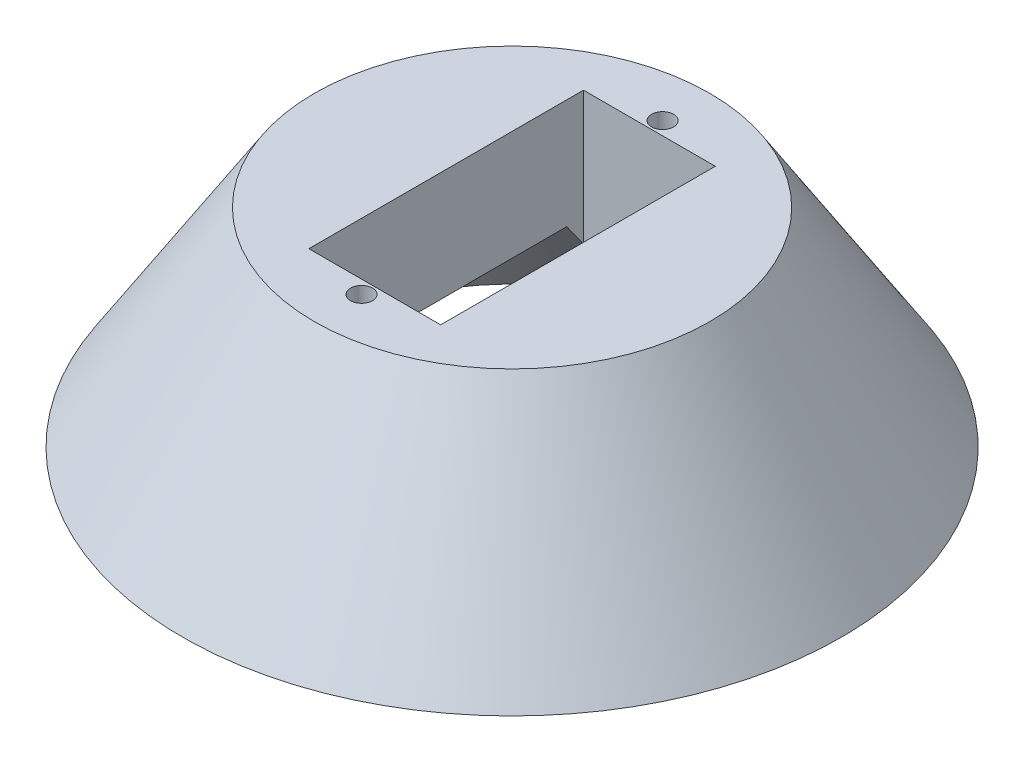
ISO-10303-21;
HEADER;
FILE_DESCRIPTION(('STEP AP214'),'2;1');
FILE_NAME('part.step','',(''),(''),'','','');
FILE_SCHEMA(('AUTOMOTIVE_DESIGN { 1 0 10303 214 1 1 1 1 }'));
ENDSEC;
DATA;
#1=APPLICATION_CONTEXT('core data for automotive mechanical design processes');
#2=APPLICATION_PROTOCOL_DEFINITION('international standard','automotive_design',2000,#1);
#3=PRODUCT_CONTEXT('',#1,'mechanical');
#4=PRODUCT('Part','Part','',(#3));
#5=PRODUCT_RELATED_PRODUCT_CATEGORY('part','',(#4));
#6=PRODUCT_DEFINITION_FORMATION('','',#4);
#7=PRODUCT_DEFINITION_CONTEXT('part definition',#1,'design');
#8=PRODUCT_DEFINITION('design','',#6,#7);
#9=PRODUCT_DEFINITION_SHAPE('','',#8);
#10=(LENGTH_UNIT() NAMED_UNIT(*) SI_UNIT(.MILLI.,.METRE.));
#11=(NAMED_UNIT(*) PLANE_ANGLE_UNIT() SI_UNIT($,.RADIAN.));
#12=(NAMED_UNIT(*) SI_UNIT($,.STERADIAN.) SOLID_ANGLE_UNIT());
#13=UNCERTAINTY_MEASURE_WITH_UNIT(LENGTH_MEASURE(1.E-05),#10,'distance_accuracy_value','');
#14=(GEOMETRIC_REPRESENTATION_CONTEXT(3) GLOBAL_UNCERTAINTY_ASSIGNED_CONTEXT((#13)) GLOBAL_UNIT_ASSIGNED_CONTEXT((#10,
#11,#12)) REPRESENTATION_CONTEXT('',''));
#15=CARTESIAN_POINT('',(0.,0.,0.));
#16=DIRECTION('',(0.,0.,1.));
#17=DIRECTION('',(1.,0.,0.));
#18=AXIS2_PLACEMENT_3D('',#15,#16,#17);
#19=CARTESIAN_POINT('',(0.,8.87265515455283,0.));
#20=DIRECTION('',(0.,-1.,0.));
#21=DIRECTION('',(0.,0.,-1.));
#22=AXIS2_PLACEMENT_3D('',#19,#20,#21);
#23=PLANE('',#22);
#24=DIRECTION('',(0.,0.,1.));
#25=VECTOR('',#24,1.);
#26=CARTESIAN_POINT('',(6.,8.87265515455283,0.));
#27=LINE('',#26,#25);
#28=CARTESIAN_POINT('',(6.,8.87265515455283,-10.9751087622099));
#29=VERTEX_POINT('',#28);
#30=CARTESIAN_POINT('',(6.,8.87265515455283,10.9751087622099));
#31=VERTEX_POINT('',#30);
#32=EDGE_CURVE('E143',#29,#31,#27,.T.);
#33=ORIENTED_EDGE('',*,*,#32,.F.);
#34=CARTESIAN_POINT('',(0.,8.87265515455283,0.));
#35=DIRECTION('',(0.,-1.,0.));
#36=DIRECTION('',(0.,0.,-1.));
#37=AXIS2_PLACEMENT_3D('',#34,#35,#36);
#38=CIRCLE('',#37,12.5081178577089);
#39=EDGE_CURVE('E150',#29,#31,#38,.T.);
#40=ORIENTED_EDGE('',*,*,#39,.T.);
#41=EDGE_LOOP('',(#33,#40));
#42=FACE_BOUND('',#41,.T.);
#43=ADVANCED_FACE('F35',(#42),#23,.T.);
#44=DIRECTION('',(-1.,0.,0.));
#45=VECTOR('',#44,1.);
#46=CARTESIAN_POINT('',(0.,8.87265515455283,12.5));
#47=LINE('',#46,#45);
#48=CARTESIAN_POINT('',(0.450568909643525,8.87265515455283,12.5));
#49=VERTEX_POINT('',#48);
#50=CARTESIAN_POINT('',(-0.450568909643525,8.87265515455284,12.5));
#51=VERTEX_POINT('',#50);
#52=EDGE_CURVE('E141',#49,#51,#47,.T.);
#53=ORIENTED_EDGE('',*,*,#52,.F.);
#54=EDGE_CURVE('E212',#49,#51,#38,.T.);
#55=ORIENTED_EDGE('',*,*,#54,.T.);
#56=EDGE_LOOP('',(#53,#55));
#57=FACE_BOUND('',#56,.T.);
#58=ADVANCED_FACE('F194',(#57),#23,.T.);
#59=DIRECTION('',(0.,0.,-1.));
#60=VECTOR('',#59,1.);
#61=CARTESIAN_POINT('',(-6.,8.87265515455283,0.));
#62=LINE('',#61,#60);
#63=CARTESIAN_POINT('',(-6.,8.87265515455283,10.9751087622099));
#64=VERTEX_POINT('',#63);
#65=CARTESIAN_POINT('',(-6.,8.87265515455283,-10.9751087622099));
#66=VERTEX_POINT('',#65);
#67=EDGE_CURVE('E139',#64,#66,#62,.T.);
#68=ORIENTED_EDGE('',*,*,#67,.F.);
#69=EDGE_CURVE('E149',#64,#66,#38,.T.);
#70=ORIENTED_EDGE('',*,*,#69,.T.);
#71=EDGE_LOOP('',(#68,#70));
#72=FACE_BOUND('',#71,.T.);
#73=ADVANCED_FACE('F186',(#72),#23,.T.);
#74=CARTESIAN_POINT('',(-30.,0.,0.));
#75=DIRECTION('',(0.,1.,0.));
#76=DIRECTION('',(0.,0.,1.));
#77=AXIS2_PLACEMENT_3D('',#74,#75,#76);
#78=PLANE('',#77);
#79=CARTESIAN_POINT('',(0.,0.,0.));
#80=DIRECTION('',(0.,1.,0.));
#81=DIRECTION('',(0.,0.,1.));
#82=AXIS2_PLACEMENT_3D('',#79,#80,#81);
#83=CIRCLE('',#82,18.1497120575028);
#84=CARTESIAN_POINT('',(0.,0.,18.1497120575028));
#85=VERTEX_POINT('',#84);
#86=EDGE_CURVE('E145',#85,#85,#83,.F.);
#87=ORIENTED_EDGE('',*,*,#86,.F.);
#88=EDGE_LOOP('',(#87));
#89=FACE_BOUND('',#88,.T.);
#90=CARTESIAN_POINT('',(0.,0.,0.));
#91=DIRECTION('',(0.,-1.,0.));
#92=DIRECTION('',(0.,0.,-1.));
#93=AXIS2_PLACEMENT_3D('',#90,#91,#92);
#94=CIRCLE('',#93,30.);
#95=CARTESIAN_POINT('',(0.,0.,-30.));
#96=VERTEX_POINT('',#95);
#97=EDGE_CURVE('E153',#96,#96,#94,.T.);
#98=ORIENTED_EDGE('',*,*,#97,.T.);
#99=EDGE_LOOP('',(#98));
#100=FACE_BOUND('',#99,.T.);
#101=ADVANCED_FACE('F37',(#89,#100),#78,.F.);
#102=CARTESIAN_POINT('',(0.,18.8726551545528,0.));
#103=DIRECTION('',(0.,-1.,0.));
#104=DIRECTION('',(0.,0.,-1.));
#105=AXIS2_PLACEMENT_3D('',#102,#103,#104);
#106=PLANE('',#105);
#107=CARTESIAN_POINT('',(0.,18.8726551545528,13.7));
#108=DIRECTION('',(0.,1.,0.));
#109=DIRECTION('',(0.,0.,1.));
#110=AXIS2_PLACEMENT_3D('',#107,#108,#109);
#111=CIRCLE('',#110,1.);
#112=CARTESIAN_POINT('',(0.,18.8726551545528,14.7));
#113=VERTEX_POINT('',#112);
#114=EDGE_CURVE('E231',#113,#113,#111,.T.);
#115=ORIENTED_EDGE('',*,*,#114,.F.);
#116=EDGE_LOOP('',(#115));
#117=FACE_BOUND('',#116,.T.);
#118=CARTESIAN_POINT('',(0.,18.8726551545528,-13.7));
#119=DIRECTION('',(0.,1.,0.));
#120=DIRECTION('',(0.,0.,1.));
#121=AXIS2_PLACEMENT_3D('',#118,#119,#120);
#122=CIRCLE('',#121,1.);
#123=CARTESIAN_POINT('',(0.,18.8726551545528,-12.7));
#124=VERTEX_POINT('',#123);
#125=EDGE_CURVE('E225',#124,#124,#122,.T.);
#126=ORIENTED_EDGE('',*,*,#125,.F.);
#127=EDGE_LOOP('',(#126));
#128=FACE_BOUND('',#127,.T.);
#129=DIRECTION('',(-1.,0.,0.));
#130=VECTOR('',#129,1.);
#131=CARTESIAN_POINT('',(-6.,18.8726551545528,-12.5));
#132=LINE('',#131,#130);
#133=CARTESIAN_POINT('',(6.,18.8726551545528,-12.5));
#134=VERTEX_POINT('',#133);
#135=CARTESIAN_POINT('',(-6.,18.8726551545528,-12.5));
#136=VERTEX_POINT('',#135);
#137=EDGE_CURVE('E122',#134,#136,#132,.T.);
#138=ORIENTED_EDGE('',*,*,#137,.F.);
#139=DIRECTION('',(0.,0.,-1.));
#140=VECTOR('',#139,1.);
#141=CARTESIAN_POINT('',(6.,18.8726551545528,-12.5));
#142=LINE('',#141,#140);
#143=CARTESIAN_POINT('',(6.,18.8726551545528,12.5));
#144=VERTEX_POINT('',#143);
#145=EDGE_CURVE('E58',#144,#134,#142,.T.);
#146=ORIENTED_EDGE('',*,*,#145,.F.);
#147=DIRECTION('',(1.,0.,0.));
#148=VECTOR('',#147,1.);
#149=CARTESIAN_POINT('',(-6.,18.8726551545528,12.5));
#150=LINE('',#149,#148);
#151=CARTESIAN_POINT('',(-6.,18.8726551545528,12.5));
#152=VERTEX_POINT('',#151);
#153=EDGE_CURVE('E129',#152,#144,#150,.T.);
#154=ORIENTED_EDGE('',*,*,#153,.F.);
#155=DIRECTION('',(0.,0.,1.));
#156=VECTOR('',#155,1.);
#157=CARTESIAN_POINT('',(-6.,18.8726551545528,-12.5));
#158=LINE('',#157,#156);
#159=EDGE_CURVE('E113',#136,#152,#158,.T.);
#160=ORIENTED_EDGE('',*,*,#159,.F.);
#161=EDGE_LOOP('',(#138,#146,#154,#160));
#162=FACE_BOUND('',#161,.T.);
#163=CARTESIAN_POINT('',(0.,18.8726551545528,0.));
#164=DIRECTION('',(0.,-1.,0.));
#165=DIRECTION('',(0.,0.,-1.));
#166=AXIS2_PLACEMENT_3D('',#163,#164,#165);
#167=CIRCLE('',#166,18.);
#168=CARTESIAN_POINT('',(0.,18.8726551545528,-18.));
#169=VERTEX_POINT('',#168);
#170=EDGE_CURVE('E156',#169,#169,#167,.T.);
#171=ORIENTED_EDGE('',*,*,#170,.F.);
#172=EDGE_LOOP('',(#171));
#173=FACE_BOUND('',#172,.T.);
#174=ADVANCED_FACE('F126',(#117,#128,#162,#173),#106,.F.);
#175=CARTESIAN_POINT('',(0.,18.8726551545528,0.));
#176=DIRECTION('',(0.,-1.,0.));
#177=DIRECTION('',(0.,0.,-1.));
#178=AXIS2_PLACEMENT_3D('',#175,#176,#177);
#179=CONICAL_SURFACE('',#178,18.,0.566356836274327);
#180=ORIENTED_EDGE('',*,*,#97,.F.);
#181=EDGE_LOOP('',(#180));
#182=FACE_BOUND('',#181,.T.);
#183=ORIENTED_EDGE('',*,*,#170,.T.);
#184=EDGE_LOOP('',(#183));
#185=FACE_BOUND('',#184,.T.);
#186=ADVANCED_FACE('F184',(#182,#185),#179,.T.);
#187=DIRECTION('',(1.,0.,0.));
#188=VECTOR('',#187,1.);
#189=CARTESIAN_POINT('',(0.,8.87265515455283,-12.5));
#190=LINE('',#189,#188);
#191=CARTESIAN_POINT('',(-0.450568909643315,8.87265515455283,-12.5));
#192=VERTEX_POINT('',#191);
#193=CARTESIAN_POINT('',(0.450568909643315,8.87265515455283,-12.5));
#194=VERTEX_POINT('',#193);
#195=EDGE_CURVE('E66',#192,#194,#190,.T.);
#196=ORIENTED_EDGE('',*,*,#195,.F.);
#197=EDGE_CURVE('E146',#192,#194,#38,.T.);
#198=ORIENTED_EDGE('',*,*,#197,.T.);
#199=EDGE_LOOP('',(#196,#198));
#200=FACE_BOUND('',#199,.T.);
#201=ADVANCED_FACE('F182',(#200),#23,.T.);
#202=CARTESIAN_POINT('',(0.,13.5070422419722,0.));
#203=DIRECTION('',(0.,-1.,0.));
#204=DIRECTION('',(0.,0.,-1.));
#205=AXIS2_PLACEMENT_3D('',#202,#203,#204);
#206=CONICAL_SURFACE('',#205,9.56138648400415,0.566356836274327);
#207=CARTESIAN_POINT('',(5.99999999999999,-15.9168781527108,-27.6262624378301));
#208=CARTESIAN_POINT('',(5.99999999999999,-15.3126835724449,-27.233132790407));
#209=CARTESIAN_POINT('',(5.99999999999999,-14.7086596688753,-26.8397408767398));
#210=CARTESIAN_POINT('',(5.99999999999999,-13.5010060074643,-26.0523516327815));
#211=CARTESIAN_POINT('',(5.99999999999999,-12.8973762499001,-25.6583543020652));
#212=CARTESIAN_POINT('',(5.99999999999999,-11.0869758609715,-24.4752142248008));
#213=CARTESIAN_POINT('',(5.99999999999999,-9.88087718198602,-23.6850424400323));
#214=CARTESIAN_POINT('',(5.99999999999999,-7.46555358113903,-22.0974124261076));
#215=CARTESIAN_POINT('',(5.99999999999999,-6.25633969599038,-21.2999373996958));
#216=CARTESIAN_POINT('',(5.99999999999999,-3.84143117645468,-19.700039547942));
#217=CARTESIAN_POINT('',(5.99999999999999,-2.6357360669921,-18.8976174408189));
#218=CARTESIAN_POINT('',(5.99999999999999,-0.757114520321862,-17.6391209416635));
#219=CARTESIAN_POINT('',(5.99999999999999,-0.0825167022128491,-17.1855422019821));
#220=CARTESIAN_POINT('',(5.99999999999999,1.26472542965406,-16.2754941540789));
#221=CARTESIAN_POINT('',(6.,1.93736974814721,-15.8190248528723));
#222=CARTESIAN_POINT('',(6.,3.28046335792535,-14.9021968694587));
#223=CARTESIAN_POINT('',(6.,3.95091148473578,-14.4418364794238));
#224=CARTESIAN_POINT('',(6.,5.28847181410914,-13.5163337713375));
#225=CARTESIAN_POINT('',(6.,5.955584118522,-13.0511916006258));
#226=CARTESIAN_POINT('',(6.,7.28351983328237,-12.1157721863574));
#227=CARTESIAN_POINT('',(6.,7.9443553622316,-11.6455122036121));
#228=CARTESIAN_POINT('',(6.,8.93087755007904,-10.9334703818235));
#229=CARTESIAN_POINT('',(6.,9.25895239805388,-10.6949976618883));
#230=CARTESIAN_POINT('',(6.,9.91315804063228,-10.2154007818022));
#231=CARTESIAN_POINT('',(6.,10.2392888458522,-9.97427663615103));
#232=CARTESIAN_POINT('',(6.,10.8889121542176,-9.48902104127777));
#233=CARTESIAN_POINT('',(6.,11.2124065168235,-9.24489208445668));
#234=CARTESIAN_POINT('',(6.,11.8564132462709,-8.75273388074434));
#235=CARTESIAN_POINT('',(6.,12.1769256568281,-8.50470469117457));
#236=CARTESIAN_POINT('',(6.,12.8140761956443,-8.00385757957522));
#237=CARTESIAN_POINT('',(6.,13.130715183779,-7.7510407533326));
#238=CARTESIAN_POINT('',(6.,13.7590184537992,-7.23931181870506));
#239=CARTESIAN_POINT('',(6.,14.0706830871404,-6.98040014417015));
#240=CARTESIAN_POINT('',(6.,14.525985432256,-6.59222443113));
#241=CARTESIAN_POINT('',(6.,14.6722193621911,-6.46600361465007));
#242=CARTESIAN_POINT('',(6.,14.9629028683053,-6.21150780494194));
#243=CARTESIAN_POINT('',(6.,15.1073523685431,-6.08323272481863));
#244=CARTESIAN_POINT('',(6.,15.3942104903811,-5.82428259589198));
#245=CARTESIAN_POINT('',(6.,15.5366181204284,-5.69360644698792));
#246=CARTESIAN_POINT('',(6.,15.8189179734786,-5.42956405902529));
#247=CARTESIAN_POINT('',(6.,15.9588102397277,-5.2961978663));
#248=CARTESIAN_POINT('',(6.,16.234583156384,-5.0273147544182));
#249=CARTESIAN_POINT('',(6.,16.370485277699,-4.89181990926772));
#250=CARTESIAN_POINT('',(6.,16.6386497474489,-4.61727788563721));
#251=CARTESIAN_POINT('',(6.,16.7709122936149,-4.47823090093262));
#252=CARTESIAN_POINT('',(6.,17.0308707852605,-4.19607936025323));
#253=CARTESIAN_POINT('',(6.,17.1585695549895,-4.05297741553014));
#254=CARTESIAN_POINT('',(6.,17.4083397347131,-3.76196318558314));
#255=CARTESIAN_POINT('',(6.,17.5304122849731,-3.61405188552675));
#256=CARTESIAN_POINT('',(6.,17.7413702588891,-3.34573127258394));
#257=CARTESIAN_POINT('',(6.,17.831652666456,-3.22642286932841));
#258=CARTESIAN_POINT('',(6.,18.0069218328438,-2.98395960997689));
#259=CARTESIAN_POINT('',(6.,18.0919086795007,-2.86080481773077));
#260=CARTESIAN_POINT('',(6.,18.255517002875,-2.6100354621002));
#261=CARTESIAN_POINT('',(6.,18.3341283234257,-2.48241422928049));
#262=CARTESIAN_POINT('',(6.,18.4833293632309,-2.22251792254373));
#263=CARTESIAN_POINT('',(6.,18.5539185552323,-2.09024254348107));
#264=CARTESIAN_POINT('',(6.,18.6864450288053,-1.81830790057144));
#265=CARTESIAN_POINT('',(6.,18.7481960779033,-1.67855686587413));
#266=CARTESIAN_POINT('',(6.,18.8591602645472,-1.3941062007895));
#267=CARTESIAN_POINT('',(6.,18.908374145935,-1.24940686456762));
#268=CARTESIAN_POINT('',(6.,18.9916899752537,-0.956272249012215));
#269=CARTESIAN_POINT('',(6.,19.0258507221621,-0.807853942814166));
#270=CARTESIAN_POINT('',(6.,19.0772277103534,-0.508105959752052));
#271=CARTESIAN_POINT('',(6.,19.0944505471445,-0.3567774395276));
#272=CARTESIAN_POINT('',(6.,19.1095665746562,-0.0754010957673041));
#273=CARTESIAN_POINT('',(6.,19.1099209945149,0.0545179889062065));
#274=CARTESIAN_POINT('',(6.,19.0974169083773,0.313706434806741));
#275=CARTESIAN_POINT('',(6.,19.0845593967104,0.442975844192578));
#276=CARTESIAN_POINT('',(6.,19.0462813195916,0.699768640661928));
#277=CARTESIAN_POINT('',(6.,19.0208461225385,0.827289816042772));
#278=CARTESIAN_POINT('',(6.,18.9585999941954,1.07951149670796));
#279=CARTESIAN_POINT('',(6.,18.9217866484432,1.2042113972798));
#280=CARTESIAN_POINT('',(6.,18.8253089215805,1.48823933558494));
#281=CARTESIAN_POINT('',(6.,18.7620985409945,1.64635901108841));
#282=CARTESIAN_POINT('',(6.,18.6219239486926,1.95634675048249));
#283=CARTESIAN_POINT('',(6.,18.5449533709329,2.10821188057559));
#284=CARTESIAN_POINT('',(6.,18.3798046770518,2.40645981522455));
#285=CARTESIAN_POINT('',(6.,18.2915831830074,2.55281840009989));
#286=CARTESIAN_POINT('',(6.,18.1527946691678,2.76810154864737));
#287=CARTESIAN_POINT('',(6.,18.1054612969433,2.83914596446117));
#288=CARTESIAN_POINT('',(6.,18.0088657065688,2.97991051863297));
#289=CARTESIAN_POINT('',(6.,17.959603528388,3.04963068438803));
#290=CARTESIAN_POINT('',(6.,17.8064472297994,3.26078476143411));
#291=CARTESIAN_POINT('',(6.,17.6997859508057,3.40021598872372));
#292=CARTESIAN_POINT('',(6.,17.4807052747677,3.67449892829697));
#293=CARTESIAN_POINT('',(6.,17.3682843841949,3.80934943752149));
#294=CARTESIAN_POINT('',(6.,17.13872377164,4.07516730794222));
#295=CARTESIAN_POINT('',(6.,17.0215799759204,4.20613114004307));
#296=CARTESIAN_POINT('',(6.,16.7835132673664,4.46458588720908));
#297=CARTESIAN_POINT('',(6.,16.6625899889084,4.59207646402782));
#298=CARTESIAN_POINT('',(6.,16.2943235026672,4.97092179454138));
#299=CARTESIAN_POINT('',(6.,16.0422979387272,5.2177256477209));
#300=CARTESIAN_POINT('',(6.,15.5297137164716,5.70195953473538));
#301=CARTESIAN_POINT('',(6.,15.2691590871864,5.9393938809639));
#302=CARTESIAN_POINT('',(6.,14.737619694837,6.41070089984397));
#303=CARTESIAN_POINT('',(6.,14.4665359062273,6.64446152336047));
#304=CARTESIAN_POINT('',(6.,13.9194320614499,7.10616730352582));
#305=CARTESIAN_POINT('',(6.,13.6434114935506,7.33411185128532));
#306=CARTESIAN_POINT('',(6.,13.0882349441316,7.78478511097461));
#307=CARTESIAN_POINT('',(6.,12.8090879141433,8.00752487635944));
#308=CARTESIAN_POINT('',(6.,12.2478256349905,8.44919771963582));
#309=CARTESIAN_POINT('',(6.,11.9657105259886,8.6681309759997));
#310=CARTESIAN_POINT('',(6.,11.3926075190947,9.10783221126414));
#311=CARTESIAN_POINT('',(6.,11.101564169824,9.328527817415));
#312=CARTESIAN_POINT('',(6.,10.5174272434571,9.76719088565178));
#313=CARTESIAN_POINT('',(6.,10.2243336463214,9.9851583210138));
#314=CARTESIAN_POINT('',(6.,9.34250576089848,10.6356583278152));
#315=CARTESIAN_POINT('',(6.,8.75124838794572,11.0647703070878));
#316=CARTESIAN_POINT('',(6.,7.5638980356108,11.9164463249209));
#317=CARTESIAN_POINT('',(6.,6.96780423117829,12.3390092088973));
#318=CARTESIAN_POINT('',(6.,5.7721079263586,13.1791475528772));
#319=CARTESIAN_POINT('',(6.,5.17250539367885,13.5967229668705));
#320=CARTESIAN_POINT('',(6.,3.96964889123346,14.4287108442681));
#321=CARTESIAN_POINT('',(6.,3.3663905265421,14.8431169452386));
#322=CARTESIAN_POINT('',(6.,2.15779256709644,15.6688873676963));
#323=CARTESIAN_POINT('',(6.,1.55245296167229,16.0802516735551));
#324=CARTESIAN_POINT('',(6.,0.340188151452066,16.900494885644));
#325=CARTESIAN_POINT('',(6.,-0.266736875804679,17.3093740544292));
#326=CARTESIAN_POINT('',(6.,-1.48192355036626,18.1251412091322));
#327=CARTESIAN_POINT('',(6.,-2.0901851986106,18.5320291936497));
#328=CARTESIAN_POINT('',(6.,-3.79682009246443,19.6703449594558));
#329=CARTESIAN_POINT('',(6.,-4.8964207459566,20.3999323312618));
#330=CARTESIAN_POINT('',(6.,-7.09820801907666,21.8552672842211));
#331=CARTESIAN_POINT('',(6.,-8.20039472069587,22.5810147411881));
#332=CARTESIAN_POINT('',(6.,-10.4041594091179,24.0279572575046));
#333=CARTESIAN_POINT('',(6.,-11.5057330615638,24.7491589215155));
#334=CARTESIAN_POINT('',(6.,-13.7103195982903,26.1892684798272));
#335=CARTESIAN_POINT('',(6.,-14.8133324266,26.9081764597933));
#336=CARTESIAN_POINT('',(6.,-15.9168781527108,27.6262624378301));
#337=B_SPLINE_CURVE_WITH_KNOTS('',3,(#207,#208,#209,#210,#211,#212,#213,#214,#215,#216,#217,
#218,#219,#220,#221,#222,#223,#224,#225,#226,#227,#228,#229,#230,#231,#232,#233,#234,#235,#236,
#237,#238,#239,#240,#241,#242,#243,#244,#245,#246,#247,#248,#249,#250,#251,#252,#253,#254,#255,
#256,#257,#258,#259,#260,#261,#262,#263,#264,#265,#266,#267,#268,#269,#270,#271,#272,#273,#274,
#275,#276,#277,#278,#279,#280,#281,#282,#283,#284,#285,#286,#287,#288,#289,#290,#291,#292,#293,
#294,#295,#296,#297,#298,#299,#300,#301,#302,#303,#304,#305,#306,#307,#308,#309,#310,#311,#312,
#313,#314,#315,#316,#317,#318,#319,#320,#321,#322,#323,#324,#325,#326,#327,#328,#329,#330,#331,
#332,#333,#334,#335,#336),.UNSPECIFIED.,.F.,.F.,(4,2,2,2,2,2,2,2,2,2,2,2,2,2,2,2,2,2,2,2,2,2,2,
2,2,2,2,2,2,2,2,2,2,2,2,2,2,2,2,2,2,2,2,2,2,2,2,2,2,2,2,2,2,2,2,2,2,2,2,2,2,2,2,2,4),(0.,
2.16250257001752,4.32500665965879,8.65066995335786,12.9961749482287,17.3410632583344,
19.7797750976502,22.2184810206227,24.6583195101852,27.0980830456371,29.5312575514592,
30.748013941816,31.9647636814151,33.1805643546738,34.3963471760549,35.6118550159116,
36.8272765922738,37.4067823811766,37.9863127481969,38.5661156092595,39.1459084923154,
39.7215732622518,40.2972066954423,40.8724775075751,41.4476312122697,41.8963669027288,
42.3450951481523,42.7945247201779,43.2439838138271,43.7018381354544,44.1596652858228,
44.6156879151327,45.0715329019102,45.4606260586614,45.8496899344252,46.2392074760862,
46.6288077308424,47.1388126894372,47.6490542111969,48.161326068732,48.4174061767696,
48.6734809810487,49.1999196884482,49.7264956048332,50.2535358660281,50.7806272714064,
51.8385014460124,52.8958829070867,53.9696343714838,55.043497790288,56.114823352054,
57.1860985473592,58.2818505688612,59.3776133154604,61.5692293496179,63.761227461433,
65.9532457791252,68.1488841687064,70.3445338314604,72.5399473442138,74.7353624006096,
78.694235101451,82.6532350628621,86.6032151221549,90.5530458878347),.UNSPECIFIED.);
#338=CARTESIAN_POINT('',(6.,6.73798994317377,12.5));
#339=VERTEX_POINT('',#338);
#340=EDGE_CURVE('E11',#31,#339,#337,.T.);
#341=ORIENTED_EDGE('',*,*,#340,.F.);
#342=ORIENTED_EDGE('',*,*,#39,.F.);
#343=CARTESIAN_POINT('',(6.,6.73798994317376,-12.5));
#344=VERTEX_POINT('',#343);
#345=EDGE_CURVE('E51',#344,#29,#337,.T.);
#346=ORIENTED_EDGE('',*,*,#345,.F.);
#347=CARTESIAN_POINT('',(-14.9545644898441,-2.1090653110314,-12.5));
#348=CARTESIAN_POINT('',(-14.7905860451103,-1.91119687699622,-12.5));
#349=CARTESIAN_POINT('',(-14.6259537384979,-1.71387070684671,-12.5));
#350=CARTESIAN_POINT('',(-14.2952641459143,-1.32041120754002,-12.5));
#351=CARTESIAN_POINT('',(-14.1292068385113,-1.12427789639942,-12.5));
#352=CARTESIAN_POINT('',(-13.6286430897577,-0.537738022586104,-12.5));
#353=CARTESIAN_POINT('',(-13.291829114381,-0.149293490649965,-12.5));
#354=CARTESIAN_POINT('',(-12.6074278901442,0.625195437029527,-12.5));
#355=CARTESIAN_POINT('',(-12.2597651823796,1.0111732815467,-12.5));
#356=CARTESIAN_POINT('',(-11.555654024671,1.77497877032646,-12.5));
#357=CARTESIAN_POINT('',(-11.199206550925,2.15280731150002,-12.5));
#358=CARTESIAN_POINT('',(-10.4541185132385,2.92043890116477,-12.5));
#359=CARTESIAN_POINT('',(-10.0648260445997,3.30961145445404,-12.5));
#360=CARTESIAN_POINT('',(-9.27146681100157,4.07300619295772,-12.5));
#361=CARTESIAN_POINT('',(-8.86739533397758,4.44722352892616,-12.5));
#362=CARTESIAN_POINT('',(-8.24862880785136,4.99239159674942,-12.5));
#363=CARTESIAN_POINT('',(-8.04072169077487,5.17105615705812,-12.5));
#364=CARTESIAN_POINT('',(-7.61991566046548,5.52239445514051,-12.5));
#365=CARTESIAN_POINT('',(-7.40701714921472,5.69506867258829,-12.5));
#366=CARTESIAN_POINT('',(-6.97580914164508,6.03325189091886,-12.5));
#367=CARTESIAN_POINT('',(-6.75750317216291,6.19876537821876,-12.5));
#368=CARTESIAN_POINT('',(-6.31479281091214,6.5213910485957,-12.5));
#369=CARTESIAN_POINT('',(-6.09038953971989,6.67850475986164,-12.5));
#370=CARTESIAN_POINT('',(-5.7437863287142,6.9099710773435,-12.5));
#371=CARTESIAN_POINT('',(-5.62402006915403,6.98797692722963,-12.5));
#372=CARTESIAN_POINT('',(-5.38258287182946,7.1409791380224,-12.5));
#373=CARTESIAN_POINT('',(-5.26091194228407,7.21597551191051,-12.5));
#374=CARTESIAN_POINT('',(-4.89284953254574,7.43605584583607,-12.5));
#375=CARTESIAN_POINT('',(-4.64346037416084,7.57619602991506,-12.5));
#376=CARTESIAN_POINT('',(-4.13783940656856,7.83968489317608,-12.5));
#377=CARTESIAN_POINT('',(-3.88165820687885,7.96313015884229,-12.5));
#378=CARTESIAN_POINT('',(-3.3609367986268,8.19100533557045,-12.5));
#379=CARTESIAN_POINT('',(-3.09639833304536,8.29543918130503,-12.5));
#380=CARTESIAN_POINT('',(-2.60162683578794,8.4671403124049,-12.5));
#381=CARTESIAN_POINT('',(-2.37252989365237,8.53766868642334,-12.5));
#382=CARTESIAN_POINT('',(-1.9094988730876,8.66060382323476,-12.5));
#383=CARTESIAN_POINT('',(-1.67556532027167,8.71301254430421,-12.5));
#384=CARTESIAN_POINT('',(-1.20433909872181,8.79781353436443,-12.5));
#385=CARTESIAN_POINT('',(-0.967050595065291,8.83022871577867,-12.5));
#386=CARTESIAN_POINT('',(-0.490512829658868,8.87384789156811,-12.5));
#387=CARTESIAN_POINT('',(-0.251263593892178,8.88505216657084,-12.5));
#388=CARTESIAN_POINT('',(0.227869535798434,8.88577519403504,-12.5));
#389=CARTESIAN_POINT('',(0.467753515035951,8.87523943049983,-12.5));
#390=CARTESIAN_POINT('',(0.945606021768085,8.83282236529117,-12.5));
#391=CARTESIAN_POINT('',(1.1835745311662,8.80094086219169,-12.5));
#392=CARTESIAN_POINT('',(1.65615678123559,8.71706584172614,-12.5));
#393=CARTESIAN_POINT('',(1.89076684634792,8.66505181136989,-12.5));
#394=CARTESIAN_POINT('',(2.35515411530816,8.54276843903965,-12.5));
#395=CARTESIAN_POINT('',(2.58493061997499,8.47249647539386,-12.5));
#396=CARTESIAN_POINT('',(3.14975351557568,8.27753792726493,-12.5));
#397=CARTESIAN_POINT('',(3.48141853499191,8.14303580908989,-12.5));
#398=CARTESIAN_POINT('',(4.13152676363264,7.84521605580658,-12.5));
#399=CARTESIAN_POINT('',(4.44996143434407,7.68188015833499,-12.5));
#400=CARTESIAN_POINT('',(5.07700158322568,7.33080809872593,-12.5));
#401=CARTESIAN_POINT('',(5.38548342942102,7.1428528474124,-12.5));
#402=CARTESIAN_POINT('',(5.83915233533935,6.84733619328959,-12.5));
#403=CARTESIAN_POINT('',(5.98884806021026,6.7465802111261,-12.5));
#404=CARTESIAN_POINT('',(6.28543031313629,6.54100895519202,-12.5));
#405=CARTESIAN_POINT('',(6.43231681199564,6.43619363926772,-12.5));
#406=CARTESIAN_POINT('',(6.99030649047021,6.02754775494813,-12.5));
#407=CARTESIAN_POINT('',(7.39219698037836,5.71108974089143,-12.5));
#408=CARTESIAN_POINT('',(8.17860809477851,5.05720767060473,-12.5));
#409=CARTESIAN_POINT('',(8.5631200364915,4.71977332973918,-12.5));
#410=CARTESIAN_POINT('',(9.31885028392679,4.02832603238547,-12.5));
#411=CARTESIAN_POINT('',(9.69002834482963,3.67426929358968,-12.5));
#412=CARTESIAN_POINT('',(10.4204403587262,2.95424396758571,-12.5));
#413=CARTESIAN_POINT('',(10.7796765517187,2.58827764009969,-12.5));
#414=CARTESIAN_POINT('',(11.4675670361606,1.86869720628126,-12.5));
#415=CARTESIAN_POINT('',(11.7967800922105,1.51561526307964,-12.5));
#416=CARTESIAN_POINT('',(12.4478777791423,0.80272783164519,-12.5));
#417=CARTESIAN_POINT('',(12.7697618975205,0.442921876394061,-12.5));
#418=CARTESIAN_POINT('',(13.405157492097,-0.279742908801265,-12.5));
#419=CARTESIAN_POINT('',(13.7187105380217,-0.642565282959538,-12.5));
#420=CARTESIAN_POINT('',(14.3404415879604,-1.37267112918069,-12.5));
#421=CARTESIAN_POINT('',(14.6486206041368,-1.73995373859116,-12.5));
#422=CARTESIAN_POINT('',(14.9545644898441,-2.10906531103139,-12.5));
#423=B_SPLINE_CURVE_WITH_KNOTS('',3,(#347,#348,#349,#350,#351,#352,#353,#354,#355,#356,#357,
#358,#359,#360,#361,#362,#363,#364,#365,#366,#367,#368,#369,#370,#371,#372,#373,#374,#375,#376,
#377,#378,#379,#380,#381,#382,#383,#384,#385,#386,#387,#388,#389,#390,#391,#392,#393,#394,#395,
#396,#397,#398,#399,#400,#401,#402,#403,#404,#405,#406,#407,#408,#409,#410,#411,#412,#413,#414,
#415,#416,#417,#418,#419,#420,#421,#422),.UNSPECIFIED.,.F.,.F.,(4,2,2,2,2,2,2,2,2,2,2,2,2,2,2,2,
2,2,2,2,2,2,2,2,2,2,2,2,2,2,2,2,2,2,2,2,2,4),(0.,0.770949764093326,1.54191114359555,
3.08423076302806,4.64252796037255,6.20065276748894,7.85173922016449,9.50335676617052,
10.3256541338494,11.1478855037238,11.9695940308804,12.791152550568,13.2199014193177,
13.6486484384462,14.5063301358559,15.3588156223224,16.2111244742056,16.9295957738627,
17.6479894006427,18.3655582174381,19.0831175404871,19.802478424144,20.5218460960427,
21.2419486678575,21.9621546969986,23.034021984796,24.1065706097373,25.1894106411822,
25.7306944570568,26.2719838953418,27.805455953858,29.3396858919254,30.8782124748526,
32.4164488209359,33.8645803116179,35.312812759308,36.7513696917637,38.1896526897396),.UNSPECIFIED.);
#424=EDGE_CURVE('E159',#194,#344,#423,.T.);
#425=ORIENTED_EDGE('',*,*,#424,.F.);
#426=ORIENTED_EDGE('',*,*,#197,.F.);
#427=CARTESIAN_POINT('',(-6.,6.73798994317375,-12.5));
#428=VERTEX_POINT('',#427);
#429=EDGE_CURVE('E164',#428,#192,#423,.T.);
#430=ORIENTED_EDGE('',*,*,#429,.F.);
#431=CARTESIAN_POINT('',(-6.,-15.9168781527108,27.6262624378301));
#432=CARTESIAN_POINT('',(-6.,-15.3126835724449,27.233132790407));
#433=CARTESIAN_POINT('',(-6.,-14.7086596688753,26.8397408767398));
#434=CARTESIAN_POINT('',(-6.,-13.5010060074643,26.0523516327815));
#435=CARTESIAN_POINT('',(-6.,-12.8973762499001,25.6583543020652));
#436=CARTESIAN_POINT('',(-6.,-11.0869758609715,24.4752142248008));
#437=CARTESIAN_POINT('',(-6.,-9.88087718198603,23.6850424400324));
#438=CARTESIAN_POINT('',(-6.,-7.46555358113904,22.0974124261076));
#439=CARTESIAN_POINT('',(-6.,-6.25633969599039,21.2999373996958));
#440=CARTESIAN_POINT('',(-6.,-3.84143117645469,19.700039547942));
#441=CARTESIAN_POINT('',(-6.,-2.63573606699211,18.8976174408189));
#442=CARTESIAN_POINT('',(-6.,-0.757114520321878,17.6391209416635));
#443=CARTESIAN_POINT('',(-6.,-0.0825167022128645,17.1855422019821));
#444=CARTESIAN_POINT('',(-6.,1.26472542965405,16.2754941540789));
#445=CARTESIAN_POINT('',(-6.,1.9373697481472,15.8190248528723));
#446=CARTESIAN_POINT('',(-6.,3.28046335792534,14.9021968694587));
#447=CARTESIAN_POINT('',(-6.,3.95091148473578,14.4418364794238));
#448=CARTESIAN_POINT('',(-6.,5.28847181410913,13.5163337713375));
#449=CARTESIAN_POINT('',(-6.,5.955584118522,13.0511916006258));
#450=CARTESIAN_POINT('',(-6.,7.28351983328236,12.1157721863574));
#451=CARTESIAN_POINT('',(-6.,7.9443553622316,11.6455122036121));
#452=CARTESIAN_POINT('',(-6.,8.93087755007903,10.9334703818235));
#453=CARTESIAN_POINT('',(-6.,9.25895239805388,10.6949976618883));
#454=CARTESIAN_POINT('',(-6.,9.91315804063228,10.2154007818022));
#455=CARTESIAN_POINT('',(-6.,10.2392888458522,9.97427663615103));
#456=CARTESIAN_POINT('',(-6.,10.8889121542176,9.48902104127777));
#457=CARTESIAN_POINT('',(-6.,11.2124065168235,9.24489208445667));
#458=CARTESIAN_POINT('',(-6.,11.8564132462709,8.75273388074434));
#459=CARTESIAN_POINT('',(-6.,12.1769256568281,8.50470469117457));
#460=CARTESIAN_POINT('',(-6.,12.8140761956443,8.00385757957523));
#461=CARTESIAN_POINT('',(-6.,13.130715183779,7.7510407533326));
#462=CARTESIAN_POINT('',(-6.,13.7590184537992,7.23931181870506));
#463=CARTESIAN_POINT('',(-6.,14.0706830871404,6.98040014417015));
#464=CARTESIAN_POINT('',(-6.,14.525985432256,6.59222443113));
#465=CARTESIAN_POINT('',(-6.,14.6722193621911,6.46600361465006));
#466=CARTESIAN_POINT('',(-6.,14.9629028683053,6.21150780494193));
#467=CARTESIAN_POINT('',(-6.,15.1073523685431,6.08323272481862));
#468=CARTESIAN_POINT('',(-6.,15.3942104903811,5.82428259589198));
#469=CARTESIAN_POINT('',(-6.,15.5366181204284,5.69360644698792));
#470=CARTESIAN_POINT('',(-6.,15.8189179734786,5.42956405902528));
#471=CARTESIAN_POINT('',(-6.,15.9588102397277,5.29619786629999));
#472=CARTESIAN_POINT('',(-6.,16.234583156384,5.02731475441819));
#473=CARTESIAN_POINT('',(-6.,16.370485277699,4.89181990926772));
#474=CARTESIAN_POINT('',(-6.,16.6386497474489,4.61727788563721));
#475=CARTESIAN_POINT('',(-6.,16.7709122936149,4.47823090093262));
#476=CARTESIAN_POINT('',(-6.,17.0308707852605,4.19607936025322));
#477=CARTESIAN_POINT('',(-6.,17.1585695549895,4.05297741553014));
#478=CARTESIAN_POINT('',(-6.,17.4083397347131,3.76196318558313));
#479=CARTESIAN_POINT('',(-6.,17.5304122849731,3.61405188552675));
#480=CARTESIAN_POINT('',(-6.,17.7413702588891,3.34573127258394));
#481=CARTESIAN_POINT('',(-6.,17.831652666456,3.22642286932841));
#482=CARTESIAN_POINT('',(-6.,18.0069218328438,2.98395960997688));
#483=CARTESIAN_POINT('',(-6.,18.0919086795007,2.86080481773076));
#484=CARTESIAN_POINT('',(-6.,18.255517002875,2.61003546210019));
#485=CARTESIAN_POINT('',(-6.,18.3341283234257,2.48241422928048));
#486=CARTESIAN_POINT('',(-6.,18.4833293632309,2.22251792254373));
#487=CARTESIAN_POINT('',(-6.,18.5539185552323,2.09024254348106));
#488=CARTESIAN_POINT('',(-6.,18.6864450288053,1.81830790057143));
#489=CARTESIAN_POINT('',(-6.,18.7481960779033,1.67855686587412));
#490=CARTESIAN_POINT('',(-6.,18.8591602645472,1.39410620078949));
#491=CARTESIAN_POINT('',(-6.,18.908374145935,1.24940686456762));
#492=CARTESIAN_POINT('',(-6.,18.9916899752537,0.956272249012213));
#493=CARTESIAN_POINT('',(-6.,19.0258507221621,0.807853942814163));
#494=CARTESIAN_POINT('',(-6.,19.0772277103534,0.508105959752046));
#495=CARTESIAN_POINT('',(-6.,19.0944505471445,0.356777439527594));
#496=CARTESIAN_POINT('',(-6.,19.1095665746562,0.0754010957672981));
#497=CARTESIAN_POINT('',(-6.,19.1099209945149,-0.0545179889062123));
#498=CARTESIAN_POINT('',(-6.,19.0974169083773,-0.313706434806745));
#499=CARTESIAN_POINT('',(-6.,19.0845593967104,-0.442975844192579));
#500=CARTESIAN_POINT('',(-6.,19.0462813195916,-0.699768640661929));
#501=CARTESIAN_POINT('',(-6.,19.0208461225384,-0.827289816042775));
#502=CARTESIAN_POINT('',(-6.,18.9585999941954,-1.07951149670796));
#503=CARTESIAN_POINT('',(-6.,18.9217866484432,-1.2042113972798));
#504=CARTESIAN_POINT('',(-6.,18.8253089215805,-1.48823933558494));
#505=CARTESIAN_POINT('',(-6.,18.7620985409945,-1.64635901108841));
#506=CARTESIAN_POINT('',(-6.,18.6219239486925,-1.9563467504825));
#507=CARTESIAN_POINT('',(-6.,18.5449533709329,-2.1082118805756));
#508=CARTESIAN_POINT('',(-6.,18.3798046770518,-2.40645981522455));
#509=CARTESIAN_POINT('',(-6.,18.2915831830074,-2.5528184000999));
#510=CARTESIAN_POINT('',(-6.,18.1527946691678,-2.76810154864738));
#511=CARTESIAN_POINT('',(-6.,18.1054612969433,-2.83914596446117));
#512=CARTESIAN_POINT('',(-6.,18.0088657065688,-2.97991051863297));
#513=CARTESIAN_POINT('',(-6.,17.959603528388,-3.04963068438804));
#514=CARTESIAN_POINT('',(-6.,17.8064472297993,-3.26078476143412));
#515=CARTESIAN_POINT('',(-6.,17.6997859508057,-3.40021598872372));
#516=CARTESIAN_POINT('',(-6.,17.4807052747677,-3.67449892829699));
#517=CARTESIAN_POINT('',(-6.,17.3682843841949,-3.8093494375215));
#518=CARTESIAN_POINT('',(-6.,17.13872377164,-4.07516730794224));
#519=CARTESIAN_POINT('',(-6.,17.0215799759203,-4.20613114004308));
#520=CARTESIAN_POINT('',(-6.,16.7835132673664,-4.46458588720909));
#521=CARTESIAN_POINT('',(-6.,16.6625899889083,-4.59207646402784));
#522=CARTESIAN_POINT('',(-6.,16.2943235026672,-4.97092179454139));
#523=CARTESIAN_POINT('',(-6.,16.0422979387272,-5.21772564772091));
#524=CARTESIAN_POINT('',(-6.,15.5297137164716,-5.7019595347354));
#525=CARTESIAN_POINT('',(-6.,15.2691590871864,-5.93939388096392));
#526=CARTESIAN_POINT('',(-6.,14.737619694837,-6.41070089984399));
#527=CARTESIAN_POINT('',(-6.,14.4665359062273,-6.64446152336049));
#528=CARTESIAN_POINT('',(-6.,13.9194320614499,-7.10616730352584));
#529=CARTESIAN_POINT('',(-6.,13.6434114935506,-7.33411185128535));
#530=CARTESIAN_POINT('',(-6.,13.0882349441316,-7.78478511097464));
#531=CARTESIAN_POINT('',(-6.,12.8090879141432,-8.00752487635946));
#532=CARTESIAN_POINT('',(-6.,12.2478256349905,-8.44919771963585));
#533=CARTESIAN_POINT('',(-6.,11.9657105259886,-8.66813097599973));
#534=CARTESIAN_POINT('',(-6.,11.3926075190947,-9.10783221126417));
#535=CARTESIAN_POINT('',(-6.,11.1015641698239,-9.32852781741502));
#536=CARTESIAN_POINT('',(-6.,10.517427243457,-9.7671908856518));
#537=CARTESIAN_POINT('',(-6.,10.2243336463214,-9.98515832101383));
#538=CARTESIAN_POINT('',(-6.,9.34250576089844,-10.6356583278152));
#539=CARTESIAN_POINT('',(-6.,8.75124838794568,-11.0647703070878));
#540=CARTESIAN_POINT('',(-6.,7.56389803561076,-11.9164463249209));
#541=CARTESIAN_POINT('',(-6.,6.96780423117825,-12.3390092088973));
#542=CARTESIAN_POINT('',(-6.,5.77210792635857,-13.1791475528772));
#543=CARTESIAN_POINT('',(-6.,5.17250539367882,-13.5967229668705));
#544=CARTESIAN_POINT('',(-6.,3.96964889123343,-14.4287108442681));
#545=CARTESIAN_POINT('',(-6.,3.36639052654207,-14.8431169452386));
#546=CARTESIAN_POINT('',(-6.,2.15779256709642,-15.6688873676963));
#547=CARTESIAN_POINT('',(-6.00000000000001,1.55245296167227,-16.0802516735551));
#548=CARTESIAN_POINT('',(-6.00000000000001,0.340188151452047,-16.900494885644));
#549=CARTESIAN_POINT('',(-6.00000000000001,-0.266736875804695,-17.3093740544292));
#550=CARTESIAN_POINT('',(-6.00000000000001,-1.48192355036627,-18.1251412091322));
#551=CARTESIAN_POINT('',(-6.00000000000001,-2.09018519861061,-18.5320291936497));
#552=CARTESIAN_POINT('',(-6.00000000000001,-3.79682009246443,-19.6703449594558));
#553=CARTESIAN_POINT('',(-6.00000000000001,-4.89642074595659,-20.3999323312618));
#554=CARTESIAN_POINT('',(-6.00000000000001,-7.09820801907666,-21.8552672842211));
#555=CARTESIAN_POINT('',(-6.00000000000001,-8.20039472069588,-22.5810147411881));
#556=CARTESIAN_POINT('',(-6.00000000000001,-10.4041594091179,-24.0279572575046));
#557=CARTESIAN_POINT('',(-6.00000000000001,-11.5057330615638,-24.7491589215155));
#558=CARTESIAN_POINT('',(-6.00000000000001,-13.7103195982903,-26.1892684798272));
#559=CARTESIAN_POINT('',(-6.00000000000001,-14.8133324266,-26.9081764597933));
#560=CARTESIAN_POINT('',(-6.00000000000001,-15.9168781527108,-27.6262624378301));
#561=B_SPLINE_CURVE_WITH_KNOTS('',3,(#431,#432,#433,#434,#435,#436,#437,#438,#439,#440,#441,
#442,#443,#444,#445,#446,#447,#448,#449,#450,#451,#452,#453,#454,#455,#456,#457,#458,#459,#460,
#461,#462,#463,#464,#465,#466,#467,#468,#469,#470,#471,#472,#473,#474,#475,#476,#477,#478,#479,
#480,#481,#482,#483,#484,#485,#486,#487,#488,#489,#490,#491,#492,#493,#494,#495,#496,#497,#498,
#499,#500,#501,#502,#503,#504,#505,#506,#507,#508,#509,#510,#511,#512,#513,#514,#515,#516,#517,
#518,#519,#520,#521,#522,#523,#524,#525,#526,#527,#528,#529,#530,#531,#532,#533,#534,#535,#536,
#537,#538,#539,#540,#541,#542,#543,#544,#545,#546,#547,#548,#549,#550,#551,#552,#553,#554,#555,
#556,#557,#558,#559,#560),.UNSPECIFIED.,.F.,.F.,(4,2,2,2,2,2,2,2,2,2,2,2,2,2,2,2,2,2,2,2,2,2,2,
2,2,2,2,2,2,2,2,2,2,2,2,2,2,2,2,2,2,2,2,2,2,2,2,2,2,2,2,2,2,2,2,2,2,2,2,2,2,2,2,2,4),(0.,
2.16250257001751,4.32500665965877,8.65066995335785,12.9961749482286,17.3410632583344,
19.7797750976502,22.2184810206227,24.6583195101852,27.0980830456371,29.5312575514592,
30.748013941816,31.9647636814151,33.1805643546738,34.3963471760549,35.6118550159116,
36.8272765922737,37.4067823811766,37.9863127481969,38.5661156092595,39.1459084923154,
39.7215732622518,40.2972066954422,40.8724775075751,41.4476312122696,41.8963669027288,
42.3450951481523,42.7945247201779,43.2439838138271,43.7018381354543,44.1596652858227,
44.6156879151327,45.0715329019102,45.4606260586614,45.8496899344252,46.2392074760861,
46.6288077308424,47.1388126894372,47.6490542111969,48.161326068732,48.4174061767696,
48.6734809810487,49.1999196884482,49.7264956048332,50.2535358660281,50.7806272714064,
51.8385014460125,52.8958829070867,53.9696343714838,55.043497790288,56.1148233520541,
57.1860985473592,58.2818505688613,59.3776133154604,61.5692293496179,63.761227461433,
65.9532457791252,68.1488841687064,70.3445338314604,72.5399473442138,74.7353624006095,
78.694235101451,82.653235062862,86.6032151221549,90.5530458878347),.UNSPECIFIED.);
#562=EDGE_CURVE('E116',#66,#428,#561,.T.);
#563=ORIENTED_EDGE('',*,*,#562,.F.);
#564=ORIENTED_EDGE('',*,*,#69,.F.);
#565=CARTESIAN_POINT('',(-6.,6.73798994317377,12.5));
#566=VERTEX_POINT('',#565);
#567=EDGE_CURVE('E211',#566,#64,#561,.T.);
#568=ORIENTED_EDGE('',*,*,#567,.F.);
#569=CARTESIAN_POINT('',(14.9545644898441,-2.10906531103138,12.5));
#570=CARTESIAN_POINT('',(14.7905860451103,-1.91119687699621,12.5));
#571=CARTESIAN_POINT('',(14.6259537384979,-1.71387070684669,12.5));
#572=CARTESIAN_POINT('',(14.2952641459143,-1.32041120754001,12.5));
#573=CARTESIAN_POINT('',(14.1292068385113,-1.1242778963994,12.5));
#574=CARTESIAN_POINT('',(13.6286430897577,-0.537738022586089,12.5));
#575=CARTESIAN_POINT('',(13.291829114381,-0.14929349064995,12.5));
#576=CARTESIAN_POINT('',(12.6074278901442,0.625195437029543,12.5));
#577=CARTESIAN_POINT('',(12.2597651823795,1.01117328154672,12.5));
#578=CARTESIAN_POINT('',(11.555654024671,1.77497877032648,12.5));
#579=CARTESIAN_POINT('',(11.199206550925,2.15280731150004,12.5));
#580=CARTESIAN_POINT('',(10.4541185132385,2.92043890116478,12.5));
#581=CARTESIAN_POINT('',(10.0648260445997,3.30961145445406,12.5));
#582=CARTESIAN_POINT('',(9.27146681100156,4.07300619295773,12.5));
#583=CARTESIAN_POINT('',(8.86739533397757,4.44722352892617,12.5));
#584=CARTESIAN_POINT('',(8.24862880785136,4.99239159674943,12.5));
#585=CARTESIAN_POINT('',(8.04072169077487,5.17105615705813,12.5));
#586=CARTESIAN_POINT('',(7.61991566046547,5.52239445514052,12.5));
#587=CARTESIAN_POINT('',(7.40701714921472,5.6950686725883,12.5));
#588=CARTESIAN_POINT('',(6.97580914164507,6.03325189091887,12.5));
#589=CARTESIAN_POINT('',(6.7575031721629,6.19876537821877,12.5));
#590=CARTESIAN_POINT('',(6.31479281091214,6.52139104859571,12.5));
#591=CARTESIAN_POINT('',(6.09038953971989,6.67850475986165,12.5));
#592=CARTESIAN_POINT('',(5.7437863287142,6.90997107734351,12.5));
#593=CARTESIAN_POINT('',(5.62402006915403,6.98797692722964,12.5));
#594=CARTESIAN_POINT('',(5.38258287182946,7.14097913802242,12.5));
#595=CARTESIAN_POINT('',(5.26091194228407,7.21597551191052,12.5));
#596=CARTESIAN_POINT('',(4.89284953254574,7.43605584583608,12.5));
#597=CARTESIAN_POINT('',(4.64346037416084,7.57619602991507,12.5));
#598=CARTESIAN_POINT('',(4.13783940656857,7.83968489317609,12.5));
#599=CARTESIAN_POINT('',(3.88165820687885,7.9631301588423,12.5));
#600=CARTESIAN_POINT('',(3.3609367986268,8.19100533557046,12.5));
#601=CARTESIAN_POINT('',(3.09639833304536,8.29543918130505,12.5));
#602=CARTESIAN_POINT('',(2.60162683578794,8.46714031240491,12.5));
#603=CARTESIAN_POINT('',(2.37252989365237,8.53766868642335,12.5));
#604=CARTESIAN_POINT('',(1.9094988730876,8.66060382323477,12.5));
#605=CARTESIAN_POINT('',(1.67556532027167,8.71301254430422,12.5));
#606=CARTESIAN_POINT('',(1.20433909872181,8.79781353436444,12.5));
#607=CARTESIAN_POINT('',(0.967050595065296,8.83022871577868,12.5));
#608=CARTESIAN_POINT('',(0.490512829658873,8.87384789156813,12.5));
#609=CARTESIAN_POINT('',(0.251263593892183,8.88505216657086,12.5));
#610=CARTESIAN_POINT('',(-0.227869535798428,8.88577519403505,12.5));
#611=CARTESIAN_POINT('',(-0.467753515035943,8.87523943049985,12.5));
#612=CARTESIAN_POINT('',(-0.945606021768077,8.83282236529118,12.5));
#613=CARTESIAN_POINT('',(-1.18357453116619,8.8009408621917,12.5));
#614=CARTESIAN_POINT('',(-1.65615678123559,8.71706584172616,12.5));
#615=CARTESIAN_POINT('',(-1.89076684634792,8.6650518113699,12.5));
#616=CARTESIAN_POINT('',(-2.35515411530815,8.54276843903966,12.5));
#617=CARTESIAN_POINT('',(-2.58493061997498,8.47249647539387,12.5));
#618=CARTESIAN_POINT('',(-3.14975351557568,8.27753792726494,12.5));
#619=CARTESIAN_POINT('',(-3.4814185349919,8.14303580908991,12.5));
#620=CARTESIAN_POINT('',(-4.13152676363263,7.84521605580659,12.5));
#621=CARTESIAN_POINT('',(-4.44996143434406,7.68188015833501,12.5));
#622=CARTESIAN_POINT('',(-5.07700158322567,7.33080809872594,12.5));
#623=CARTESIAN_POINT('',(-5.38548342942101,7.14285284741242,12.5));
#624=CARTESIAN_POINT('',(-5.83915233533934,6.8473361932896,12.5));
#625=CARTESIAN_POINT('',(-5.98884806021025,6.74658021112611,12.5));
#626=CARTESIAN_POINT('',(-6.28543031313628,6.54100895519203,12.5));
#627=CARTESIAN_POINT('',(-6.43231681199563,6.43619363926773,12.5));
#628=CARTESIAN_POINT('',(-6.99030649047021,6.02754775494815,12.5));
#629=CARTESIAN_POINT('',(-7.39219698037836,5.71108974089145,12.5));
#630=CARTESIAN_POINT('',(-8.1786080947785,5.05720767060475,12.5));
#631=CARTESIAN_POINT('',(-8.56312003649149,4.71977332973919,12.5));
#632=CARTESIAN_POINT('',(-9.31885028392678,4.02832603238549,12.5));
#633=CARTESIAN_POINT('',(-9.69002834482962,3.67426929358969,12.5));
#634=CARTESIAN_POINT('',(-10.4204403587262,2.95424396758572,12.5));
#635=CARTESIAN_POINT('',(-10.7796765517187,2.5882776400997,12.5));
#636=CARTESIAN_POINT('',(-11.4675670361606,1.86869720628128,12.5));
#637=CARTESIAN_POINT('',(-11.7967800922105,1.51561526307965,12.5));
#638=CARTESIAN_POINT('',(-12.4478777791423,0.802727831645198,12.5));
#639=CARTESIAN_POINT('',(-12.7697618975205,0.442921876394071,12.5));
#640=CARTESIAN_POINT('',(-13.405157492097,-0.279742908801253,12.5));
#641=CARTESIAN_POINT('',(-13.7187105380217,-0.642565282959527,12.5));
#642=CARTESIAN_POINT('',(-14.3404415879604,-1.37267112918068,12.5));
#643=CARTESIAN_POINT('',(-14.6486206041368,-1.73995373859115,12.5));
#644=CARTESIAN_POINT('',(-14.9545644898441,-2.10906531103138,12.5));
#645=B_SPLINE_CURVE_WITH_KNOTS('',3,(#569,#570,#571,#572,#573,#574,#575,#576,#577,#578,#579,
#580,#581,#582,#583,#584,#585,#586,#587,#588,#589,#590,#591,#592,#593,#594,#595,#596,#597,#598,
#599,#600,#601,#602,#603,#604,#605,#606,#607,#608,#609,#610,#611,#612,#613,#614,#615,#616,#617,
#618,#619,#620,#621,#622,#623,#624,#625,#626,#627,#628,#629,#630,#631,#632,#633,#634,#635,#636,
#637,#638,#639,#640,#641,#642,#643,#644),.UNSPECIFIED.,.F.,.F.,(4,2,2,2,2,2,2,2,2,2,2,2,2,2,2,2,
2,2,2,2,2,2,2,2,2,2,2,2,2,2,2,2,2,2,2,2,2,4),(0.,0.770949764093327,1.54191114359555,
3.08423076302806,4.64252796037255,6.20065276748894,7.85173922016449,9.50335676617052,
10.3256541338494,11.1478855037238,11.9695940308804,12.791152550568,13.2199014193177,
13.6486484384462,14.5063301358559,15.3588156223224,16.2111244742056,16.9295957738627,
17.6479894006427,18.3655582174381,19.0831175404871,19.802478424144,20.5218460960427,
21.2419486678575,21.9621546969986,23.034021984796,24.1065706097373,25.1894106411822,
25.7306944570568,26.2719838953418,27.805455953858,29.3396858919254,30.8782124748526,
32.4164488209359,33.8645803116179,35.312812759308,36.7513696917637,38.1896526897396),.UNSPECIFIED.);
#646=EDGE_CURVE('E39',#51,#566,#645,.T.);
#647=ORIENTED_EDGE('',*,*,#646,.F.);
#648=ORIENTED_EDGE('',*,*,#54,.F.);
#649=EDGE_CURVE('E49',#339,#49,#645,.T.);
#650=ORIENTED_EDGE('',*,*,#649,.F.);
#651=EDGE_LOOP('',(#341,#342,#346,#425,#426,#430,#563,#564,#568,#647,#648,#650));
#652=FACE_BOUND('',#651,.T.);
#653=ORIENTED_EDGE('',*,*,#86,.T.);
#654=EDGE_LOOP('',(#653));
#655=FACE_BOUND('',#654,.T.);
#656=ADVANCED_FACE('F169',(#652,#655),#206,.F.);
#657=CARTESIAN_POINT('',(6.,0.,-12.5));
#658=DIRECTION('',(1.,0.,0.));
#659=DIRECTION('',(0.,0.,-1.));
#660=AXIS2_PLACEMENT_3D('',#657,#658,#659);
#661=PLANE('',#660);
#662=ORIENTED_EDGE('',*,*,#345,.T.);
#663=ORIENTED_EDGE('',*,*,#32,.T.);
#664=ORIENTED_EDGE('',*,*,#340,.T.);
#665=DIRECTION('',(0.,1.,0.));
#666=VECTOR('',#665,1.);
#667=CARTESIAN_POINT('',(6.,0.,12.5));
#668=LINE('',#667,#666);
#669=EDGE_CURVE('E134',#339,#144,#668,.T.);
#670=ORIENTED_EDGE('',*,*,#669,.T.);
#671=ORIENTED_EDGE('',*,*,#145,.T.);
#672=DIRECTION('',(0.,1.,0.));
#673=VECTOR('',#672,1.);
#674=CARTESIAN_POINT('',(6.,0.,-12.5));
#675=LINE('',#674,#673);
#676=EDGE_CURVE('E119',#344,#134,#675,.T.);
#677=ORIENTED_EDGE('',*,*,#676,.F.);
#678=EDGE_LOOP('',(#662,#663,#664,#670,#671,#677));
#679=FACE_BOUND('',#678,.T.);
#680=ADVANCED_FACE('F178',(#679),#661,.F.);
#681=CARTESIAN_POINT('',(-6.,0.,12.5));
#682=DIRECTION('',(0.,0.,1.));
#683=DIRECTION('',(1.,0.,0.));
#684=AXIS2_PLACEMENT_3D('',#681,#682,#683);
#685=PLANE('',#684);
#686=ORIENTED_EDGE('',*,*,#649,.T.);
#687=ORIENTED_EDGE('',*,*,#52,.T.);
#688=ORIENTED_EDGE('',*,*,#646,.T.);
#689=DIRECTION('',(0.,1.,0.));
#690=VECTOR('',#689,1.);
#691=CARTESIAN_POINT('',(-6.,0.,12.5));
#692=LINE('',#691,#690);
#693=EDGE_CURVE('E118',#566,#152,#692,.T.);
#694=ORIENTED_EDGE('',*,*,#693,.T.);
#695=ORIENTED_EDGE('',*,*,#153,.T.);
#696=ORIENTED_EDGE('',*,*,#669,.F.);
#697=EDGE_LOOP('',(#686,#687,#688,#694,#695,#696));
#698=FACE_BOUND('',#697,.T.);
#699=ADVANCED_FACE('F181',(#698),#685,.F.);
#700=CARTESIAN_POINT('',(-6.,0.,-12.5));
#701=DIRECTION('',(-1.,0.,0.));
#702=DIRECTION('',(0.,0.,1.));
#703=AXIS2_PLACEMENT_3D('',#700,#701,#702);
#704=PLANE('',#703);
#705=ORIENTED_EDGE('',*,*,#567,.T.);
#706=ORIENTED_EDGE('',*,*,#67,.T.);
#707=ORIENTED_EDGE('',*,*,#562,.T.);
#708=DIRECTION('',(0.,1.,0.));
#709=VECTOR('',#708,1.);
#710=CARTESIAN_POINT('',(-6.,0.,-12.5));
#711=LINE('',#710,#709);
#712=EDGE_CURVE('E108',#428,#136,#711,.T.);
#713=ORIENTED_EDGE('',*,*,#712,.T.);
#714=ORIENTED_EDGE('',*,*,#159,.T.);
#715=ORIENTED_EDGE('',*,*,#693,.F.);
#716=EDGE_LOOP('',(#705,#706,#707,#713,#714,#715));
#717=FACE_BOUND('',#716,.T.);
#718=ADVANCED_FACE('F110',(#717),#704,.F.);
#719=CARTESIAN_POINT('',(-6.,0.,-12.5));
#720=DIRECTION('',(0.,0.,-1.));
#721=DIRECTION('',(-1.,0.,0.));
#722=AXIS2_PLACEMENT_3D('',#719,#720,#721);
#723=PLANE('',#722);
#724=ORIENTED_EDGE('',*,*,#429,.T.);
#725=ORIENTED_EDGE('',*,*,#195,.T.);
#726=ORIENTED_EDGE('',*,*,#424,.T.);
#727=ORIENTED_EDGE('',*,*,#676,.T.);
#728=ORIENTED_EDGE('',*,*,#137,.T.);
#729=ORIENTED_EDGE('',*,*,#712,.F.);
#730=EDGE_LOOP('',(#724,#725,#726,#727,#728,#729));
#731=FACE_BOUND('',#730,.T.);
#732=ADVANCED_FACE('F123',(#731),#723,.F.);
#733=CARTESIAN_POINT('',(0.,13.8726551545528,-13.7));
#734=DIRECTION('',(0.,1.,0.));
#735=DIRECTION('',(0.,0.,1.));
#736=AXIS2_PLACEMENT_3D('',#733,#734,#735);
#737=CYLINDRICAL_SURFACE('',#736,1.);
#738=CARTESIAN_POINT('',(0.,13.8726551545528,-13.7));
#739=DIRECTION('',(0.,1.,0.));
#740=DIRECTION('',(0.,0.,1.));
#741=AXIS2_PLACEMENT_3D('',#738,#739,#740);
#742=CIRCLE('',#741,1.);
#743=CARTESIAN_POINT('',(0.,13.8726551545528,-12.7));
#744=VERTEX_POINT('',#743);
#745=EDGE_CURVE('E223',#744,#744,#742,.T.);
#746=ORIENTED_EDGE('',*,*,#745,.F.);
#747=EDGE_LOOP('',(#746));
#748=FACE_BOUND('',#747,.T.);
#749=ORIENTED_EDGE('',*,*,#125,.T.);
#750=EDGE_LOOP('',(#749));
#751=FACE_BOUND('',#750,.T.);
#752=ADVANCED_FACE('F176',(#748,#751),#737,.F.);
#753=CARTESIAN_POINT('',(0.,13.8726551545528,-13.7));
#754=DIRECTION('',(0.,1.,0.));
#755=DIRECTION('',(0.,0.,1.));
#756=AXIS2_PLACEMENT_3D('',#753,#754,#755);
#757=PLANE('',#756);
#758=ORIENTED_EDGE('',*,*,#745,.T.);
#759=EDGE_LOOP('',(#758));
#760=FACE_BOUND('',#759,.T.);
#761=ADVANCED_FACE('F242',(#760),#757,.T.);
#762=CARTESIAN_POINT('',(0.,13.8726551545528,13.7));
#763=DIRECTION('',(0.,1.,0.));
#764=DIRECTION('',(0.,0.,1.));
#765=AXIS2_PLACEMENT_3D('',#762,#763,#764);
#766=CYLINDRICAL_SURFACE('',#765,1.);
#767=CARTESIAN_POINT('',(0.,13.8726551545528,13.7));
#768=DIRECTION('',(0.,1.,0.));
#769=DIRECTION('',(0.,0.,1.));
#770=AXIS2_PLACEMENT_3D('',#767,#768,#769);
#771=CIRCLE('',#770,1.);
#772=CARTESIAN_POINT('',(0.,13.8726551545528,14.7));
#773=VERTEX_POINT('',#772);
#774=EDGE_CURVE('E229',#773,#773,#771,.T.);
#775=ORIENTED_EDGE('',*,*,#774,.F.);
#776=EDGE_LOOP('',(#775));
#777=FACE_BOUND('',#776,.T.);
#778=ORIENTED_EDGE('',*,*,#114,.T.);
#779=EDGE_LOOP('',(#778));
#780=FACE_BOUND('',#779,.T.);
#781=ADVANCED_FACE('F239',(#777,#780),#766,.F.);
#782=CARTESIAN_POINT('',(0.,13.8726551545528,13.7));
#783=DIRECTION('',(0.,1.,0.));
#784=DIRECTION('',(0.,0.,1.));
#785=AXIS2_PLACEMENT_3D('',#782,#783,#784);
#786=PLANE('',#785);
#787=ORIENTED_EDGE('',*,*,#774,.T.);
#788=EDGE_LOOP('',(#787));
#789=FACE_BOUND('',#788,.T.);
#790=ADVANCED_FACE('F237',(#789),#786,.T.);
#791=CLOSED_SHELL('',(#43,#58,#73,#101,#174,#186,#201,#656,#680,#699,#718,#732,#752,#761,#781,#790));
#792=MANIFOLD_SOLID_BREP('B2',#791);
#793=ADVANCED_BREP_SHAPE_REPRESENTATION('',(#18,#792),#14);
#794=SHAPE_DEFINITION_REPRESENTATION(#9,#793);
ENDSEC;
END-ISO-10303-21;
